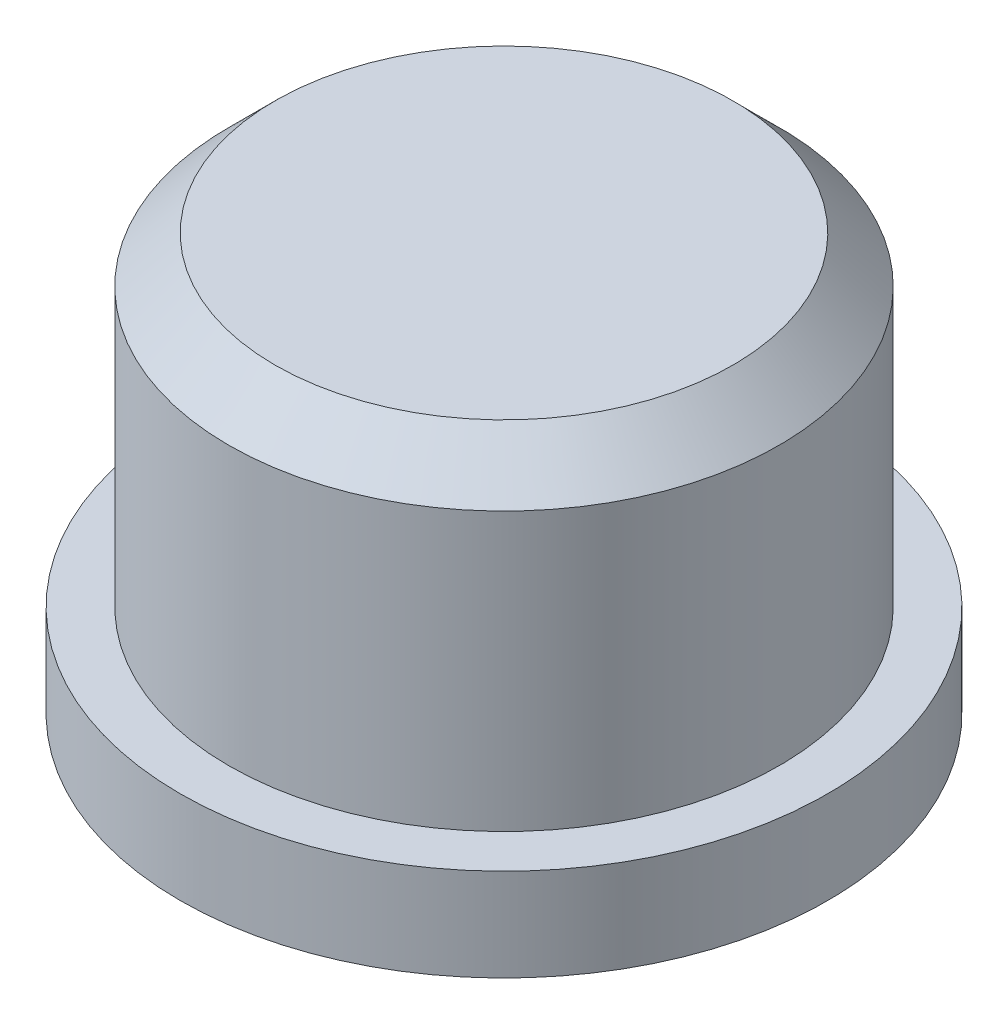
ISO-10303-21;
HEADER;
FILE_DESCRIPTION(('STEP AP214'),'2;1');
FILE_NAME('part.step','',(''),(''),'','','');
FILE_SCHEMA(('AUTOMOTIVE_DESIGN { 1 0 10303 214 1 1 1 1 }'));
ENDSEC;
DATA;
#1=APPLICATION_CONTEXT('core data for automotive mechanical design processes');
#2=APPLICATION_PROTOCOL_DEFINITION('international standard','automotive_design',2000,#1);
#3=PRODUCT_CONTEXT('',#1,'mechanical');
#4=PRODUCT('Part','Part','',(#3));
#5=PRODUCT_RELATED_PRODUCT_CATEGORY('part','',(#4));
#6=PRODUCT_DEFINITION_FORMATION('','',#4);
#7=PRODUCT_DEFINITION_CONTEXT('part definition',#1,'design');
#8=PRODUCT_DEFINITION('design','',#6,#7);
#9=PRODUCT_DEFINITION_SHAPE('','',#8);
#10=(LENGTH_UNIT() NAMED_UNIT(*) SI_UNIT(.MILLI.,.METRE.));
#11=(NAMED_UNIT(*) PLANE_ANGLE_UNIT() SI_UNIT($,.RADIAN.));
#12=(NAMED_UNIT(*) SI_UNIT($,.STERADIAN.) SOLID_ANGLE_UNIT());
#13=UNCERTAINTY_MEASURE_WITH_UNIT(LENGTH_MEASURE(1.E-05),#10,'distance_accuracy_value','');
#14=(GEOMETRIC_REPRESENTATION_CONTEXT(3) GLOBAL_UNCERTAINTY_ASSIGNED_CONTEXT((#13)) GLOBAL_UNIT_ASSIGNED_CONTEXT((#10,
#11,#12)) REPRESENTATION_CONTEXT('',''));
#15=CARTESIAN_POINT('',(0.,0.,0.));
#16=DIRECTION('',(0.,0.,1.));
#17=DIRECTION('',(1.,0.,0.));
#18=AXIS2_PLACEMENT_3D('',#15,#16,#17);
#19=CARTESIAN_POINT('',(0.,2.,0.));
#20=DIRECTION('',(0.,-1.,0.));
#21=DIRECTION('',(0.,0.,-1.));
#22=AXIS2_PLACEMENT_3D('',#19,#20,#21);
#23=CYLINDRICAL_SURFACE('',#22,7.);
#24=CARTESIAN_POINT('',(0.,2.,0.));
#25=DIRECTION('',(0.,1.,0.));
#26=DIRECTION('',(0.,0.,1.));
#27=AXIS2_PLACEMENT_3D('',#24,#25,#26);
#28=CIRCLE('',#27,7.);
#29=CARTESIAN_POINT('',(0.,2.,7.));
#30=VERTEX_POINT('',#29);
#31=EDGE_CURVE('E46',#30,#30,#28,.T.);
#32=ORIENTED_EDGE('',*,*,#31,.F.);
#33=EDGE_LOOP('',(#32));
#34=FACE_BOUND('',#33,.T.);
#35=CARTESIAN_POINT('',(0.,0.,0.));
#36=DIRECTION('',(0.,1.,0.));
#37=DIRECTION('',(0.,0.,1.));
#38=AXIS2_PLACEMENT_3D('',#35,#36,#37);
#39=CIRCLE('',#38,7.);
#40=CARTESIAN_POINT('',(0.,0.,7.));
#41=VERTEX_POINT('',#40);
#42=EDGE_CURVE('E49',#41,#41,#39,.T.);
#43=ORIENTED_EDGE('',*,*,#42,.T.);
#44=EDGE_LOOP('',(#43));
#45=FACE_BOUND('',#44,.T.);
#46=ADVANCED_FACE('F31',(#34,#45),#23,.T.);
#47=CARTESIAN_POINT('',(0.,2.,0.));
#48=DIRECTION('',(0.,1.,0.));
#49=DIRECTION('',(0.,0.,1.));
#50=AXIS2_PLACEMENT_3D('',#47,#48,#49);
#51=PLANE('',#50);
#52=CARTESIAN_POINT('',(0.,2.,0.));
#53=DIRECTION('',(0.,1.,0.));
#54=DIRECTION('',(0.,0.,1.));
#55=AXIS2_PLACEMENT_3D('',#52,#53,#54);
#56=CIRCLE('',#55,5.95);
#57=CARTESIAN_POINT('',(0.,2.,5.95));
#58=VERTEX_POINT('',#57);
#59=EDGE_CURVE('E42',#58,#58,#56,.T.);
#60=ORIENTED_EDGE('',*,*,#59,.F.);
#61=EDGE_LOOP('',(#60));
#62=FACE_BOUND('',#61,.T.);
#63=ORIENTED_EDGE('',*,*,#31,.T.);
#64=EDGE_LOOP('',(#63));
#65=FACE_BOUND('',#64,.T.);
#66=ADVANCED_FACE('F74',(#62,#65),#51,.T.);
#67=CARTESIAN_POINT('',(0.,0.,0.));
#68=DIRECTION('',(0.,1.,0.));
#69=DIRECTION('',(0.,0.,1.));
#70=AXIS2_PLACEMENT_3D('',#67,#68,#69);
#71=PLANE('',#70);
#72=CARTESIAN_POINT('',(0.,0.,0.));
#73=DIRECTION('',(0.,-1.,0.));
#74=DIRECTION('',(0.,0.,-1.));
#75=AXIS2_PLACEMENT_3D('',#72,#73,#74);
#76=CIRCLE('',#75,3.5);
#77=CARTESIAN_POINT('',(0.,0.,-3.5));
#78=VERTEX_POINT('',#77);
#79=EDGE_CURVE('E55',#78,#78,#76,.T.);
#80=ORIENTED_EDGE('',*,*,#79,.F.);
#81=EDGE_LOOP('',(#80));
#82=FACE_BOUND('',#81,.T.);
#83=ORIENTED_EDGE('',*,*,#42,.F.);
#84=EDGE_LOOP('',(#83));
#85=FACE_BOUND('',#84,.T.);
#86=ADVANCED_FACE('F70',(#82,#85),#71,.F.);
#87=CARTESIAN_POINT('',(0.,9.,0.));
#88=DIRECTION('',(0.,-1.,0.));
#89=DIRECTION('',(0.,0.,-1.));
#90=AXIS2_PLACEMENT_3D('',#87,#88,#89);
#91=CYLINDRICAL_SURFACE('',#90,5.95);
#92=CARTESIAN_POINT('',(0.,7.99999999999999,0.));
#93=DIRECTION('',(0.,1.,0.));
#94=DIRECTION('',(0.,0.,1.));
#95=AXIS2_PLACEMENT_3D('',#92,#93,#94);
#96=CIRCLE('',#95,5.95);
#97=CARTESIAN_POINT('',(0.,7.99999999999999,5.95));
#98=VERTEX_POINT('',#97);
#99=EDGE_CURVE('E10',#98,#98,#96,.F.);
#100=ORIENTED_EDGE('',*,*,#99,.T.);
#101=EDGE_LOOP('',(#100));
#102=FACE_BOUND('',#101,.T.);
#103=ORIENTED_EDGE('',*,*,#59,.T.);
#104=EDGE_LOOP('',(#103));
#105=FACE_BOUND('',#104,.T.);
#106=ADVANCED_FACE('F73',(#102,#105),#91,.T.);
#107=CARTESIAN_POINT('',(0.,9.,0.));
#108=DIRECTION('',(0.,1.,0.));
#109=DIRECTION('',(0.,0.,1.));
#110=AXIS2_PLACEMENT_3D('',#107,#108,#109);
#111=PLANE('',#110);
#112=CARTESIAN_POINT('',(0.,9.,0.));
#113=DIRECTION('',(0.,1.,0.));
#114=DIRECTION('',(0.,0.,1.));
#115=AXIS2_PLACEMENT_3D('',#112,#113,#114);
#116=CIRCLE('',#115,4.95);
#117=CARTESIAN_POINT('',(0.,9.,4.95));
#118=VERTEX_POINT('',#117);
#119=EDGE_CURVE('E38',#118,#118,#116,.T.);
#120=ORIENTED_EDGE('',*,*,#119,.T.);
#121=EDGE_LOOP('',(#120));
#122=FACE_BOUND('',#121,.T.);
#123=ADVANCED_FACE('F66',(#122),#111,.T.);
#124=CARTESIAN_POINT('',(0.,1.8,0.));
#125=DIRECTION('',(0.,-1.,0.));
#126=DIRECTION('',(0.,0.,-1.));
#127=AXIS2_PLACEMENT_3D('',#124,#125,#126);
#128=CYLINDRICAL_SURFACE('',#127,3.5);
#129=CARTESIAN_POINT('',(0.,1.8,0.));
#130=DIRECTION('',(0.,-1.,0.));
#131=DIRECTION('',(0.,0.,-1.));
#132=AXIS2_PLACEMENT_3D('',#129,#130,#131);
#133=CIRCLE('',#132,3.5);
#134=CARTESIAN_POINT('',(0.,1.8,-3.5));
#135=VERTEX_POINT('',#134);
#136=EDGE_CURVE('E52',#135,#135,#133,.T.);
#137=ORIENTED_EDGE('',*,*,#136,.F.);
#138=EDGE_LOOP('',(#137));
#139=FACE_BOUND('',#138,.T.);
#140=ORIENTED_EDGE('',*,*,#79,.T.);
#141=EDGE_LOOP('',(#140));
#142=FACE_BOUND('',#141,.T.);
#143=ADVANCED_FACE('F63',(#139,#142),#128,.F.);
#144=CARTESIAN_POINT('',(0.,1.8,0.));
#145=DIRECTION('',(0.,-1.,0.));
#146=DIRECTION('',(0.,0.,-1.));
#147=AXIS2_PLACEMENT_3D('',#144,#145,#146);
#148=PLANE('',#147);
#149=ORIENTED_EDGE('',*,*,#136,.T.);
#150=EDGE_LOOP('',(#149));
#151=FACE_BOUND('',#150,.T.);
#152=ADVANCED_FACE('F61',(#151),#148,.T.);
#153=CARTESIAN_POINT('',(0.,9.,0.));
#154=DIRECTION('',(0.,-1.,0.));
#155=DIRECTION('',(0.,0.,-1.));
#156=AXIS2_PLACEMENT_3D('',#153,#154,#155);
#157=CONICAL_SURFACE('',#156,4.95,0.785398163397447);
#158=ORIENTED_EDGE('',*,*,#99,.F.);
#159=EDGE_LOOP('',(#158));
#160=FACE_BOUND('',#159,.T.);
#161=ORIENTED_EDGE('',*,*,#119,.F.);
#162=EDGE_LOOP('',(#161));
#163=FACE_BOUND('',#162,.T.);
#164=ADVANCED_FACE('F33',(#160,#163),#157,.T.);
#165=CLOSED_SHELL('',(#46,#66,#86,#106,#123,#143,#152,#164));
#166=MANIFOLD_SOLID_BREP('B2',#165);
#167=ADVANCED_BREP_SHAPE_REPRESENTATION('',(#18,#166),#14);
#168=SHAPE_DEFINITION_REPRESENTATION(#9,#167);
ENDSEC;
END-ISO-10303-21;
